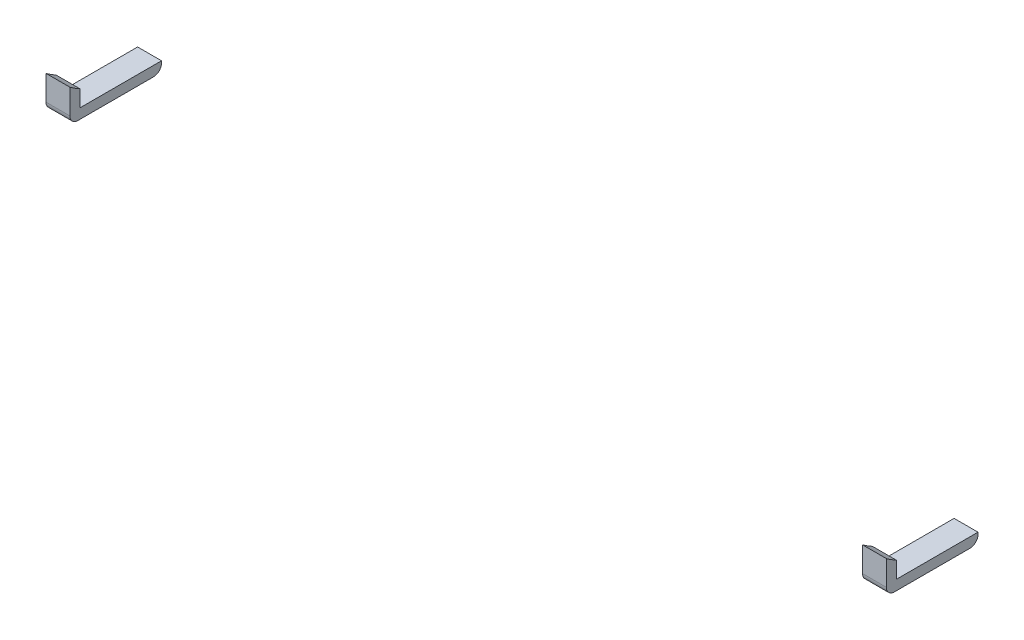
ISO-10303-21;
HEADER;
FILE_DESCRIPTION(('STEP AP214'),'2;1');
FILE_NAME('part.step','',(''),(''),'','','');
FILE_SCHEMA(('AUTOMOTIVE_DESIGN { 1 0 10303 214 1 1 1 1 }'));
ENDSEC;
DATA;
#1=APPLICATION_CONTEXT('core data for automotive mechanical design processes');
#2=APPLICATION_PROTOCOL_DEFINITION('international standard','automotive_design',2000,#1);
#3=PRODUCT_CONTEXT('',#1,'mechanical');
#4=PRODUCT('Part','Part','',(#3));
#5=PRODUCT_RELATED_PRODUCT_CATEGORY('part','',(#4));
#6=PRODUCT_DEFINITION_FORMATION('','',#4);
#7=PRODUCT_DEFINITION_CONTEXT('part definition',#1,'design');
#8=PRODUCT_DEFINITION('design','',#6,#7);
#9=PRODUCT_DEFINITION_SHAPE('','',#8);
#10=(LENGTH_UNIT() NAMED_UNIT(*) SI_UNIT(.MILLI.,.METRE.));
#11=(NAMED_UNIT(*) PLANE_ANGLE_UNIT() SI_UNIT($,.RADIAN.));
#12=(NAMED_UNIT(*) SI_UNIT($,.STERADIAN.) SOLID_ANGLE_UNIT());
#13=UNCERTAINTY_MEASURE_WITH_UNIT(LENGTH_MEASURE(1.E-05),#10,'distance_accuracy_value','');
#14=(GEOMETRIC_REPRESENTATION_CONTEXT(3) GLOBAL_UNCERTAINTY_ASSIGNED_CONTEXT((#13)) GLOBAL_UNIT_ASSIGNED_CONTEXT((#10,
#11,#12)) REPRESENTATION_CONTEXT('',''));
#15=CARTESIAN_POINT('',(0.,0.,0.));
#16=DIRECTION('',(0.,0.,1.));
#17=DIRECTION('',(1.,0.,0.));
#18=AXIS2_PLACEMENT_3D('',#15,#16,#17);
#19=CARTESIAN_POINT('',(28.554945607636,79.115000527007,-1.826522160652));
#20=DIRECTION('',(-0.999999999999996,8.74227764726197E-08,0.));
#21=DIRECTION('',(-8.74227764726197E-08,-0.999999999999996,0.));
#22=AXIS2_PLACEMENT_3D('',#19,#20,#21);
#23=CYLINDRICAL_SURFACE('',#22,0.22);
#24=DIRECTION('',(1.,0.,0.));
#25=VECTOR('',#24,1.);
#26=CARTESIAN_POINT('',(28.554945586655,78.937518127394,-1.69652217616754));
#27=LINE('',#26,#25);
#28=CARTESIAN_POINT('',(28.4949455921202,78.9375181273942,-1.69652217616788));
#29=VERTEX_POINT('',#28);
#30=CARTESIAN_POINT('',(28.5549455921205,78.9375181247715,-1.69652217616788));
#31=VERTEX_POINT('',#30);
#32=EDGE_CURVE('P0_E81',#29,#31,#27,.T.);
#33=ORIENTED_EDGE('',*,*,#32,.T.);
#34=CARTESIAN_POINT('',(28.5549456076365,79.115000527007,-1.826522160652));
#35=DIRECTION('',(0.999999999999996,-8.74227764726197E-08,0.));
#36=DIRECTION('',(8.74227764726197E-08,0.999999999999996,0.));
#37=AXIS2_PLACEMENT_3D('',#34,#35,#36);
#38=CIRCLE('',#37,0.22);
#39=CARTESIAN_POINT('',(28.5549455889137,78.9216743682792,-1.72152217802565));
#40=VERTEX_POINT('',#39);
#41=EDGE_CURVE('P0_E20',#40,#31,#38,.F.);
#42=ORIENTED_EDGE('',*,*,#41,.F.);
#43=DIRECTION('',(1.,0.,0.));
#44=VECTOR('',#43,1.);
#45=CARTESIAN_POINT('',(28.554945590735,78.921674368536,-1.721522177553));
#46=LINE('',#45,#44);
#47=CARTESIAN_POINT('',(28.4949455907349,78.9216743701693,-1.7215221793745));
#48=VERTEX_POINT('',#47);
#49=EDGE_CURVE('P0_E80',#40,#48,#46,.F.);
#50=ORIENTED_EDGE('',*,*,#49,.T.);
#51=CARTESIAN_POINT('',(28.494945607636,79.1150005322524,-1.826522160652));
#52=DIRECTION('',(-0.999999999999996,8.74227764726197E-08,0.));
#53=DIRECTION('',(-8.74227764726197E-08,-0.999999999999996,0.));
#54=AXIS2_PLACEMENT_3D('',#51,#52,#53);
#55=CIRCLE('',#54,0.22);
#56=EDGE_CURVE('P0_E121',#48,#29,#55,.T.);
#57=ORIENTED_EDGE('',*,*,#56,.T.);
#58=EDGE_LOOP('',(#33,#42,#50,#57));
#59=FACE_BOUND('',#58,.T.);
#60=ADVANCED_FACE('P0_F17',(#59),#23,.F.);
#61=CARTESIAN_POINT('',(28.554945586655,78.875000515642,-1.696522181633));
#62=DIRECTION('',(0.,8.74227765658197E-08,-0.999999999999996));
#63=DIRECTION('',(0.,0.999999999999996,8.74227765658197E-08));
#64=AXIS2_PLACEMENT_3D('',#61,#62,#63);
#65=PLANE('',#64);
#66=DIRECTION('',(-0.999999999999996,8.74227764726197E-08,0.));
#67=VECTOR('',#66,1.);
#68=CARTESIAN_POINT('',(28.554945586655,78.875000515642,-1.696522181633));
#69=LINE('',#68,#67);
#70=CARTESIAN_POINT('',(28.5549455866545,78.875000516516,-1.6965221789005));
#71=VERTEX_POINT('',#70);
#72=CARTESIAN_POINT('',(28.494945586655,78.8750005217614,-1.6965221789005));
#73=VERTEX_POINT('',#72);
#74=EDGE_CURVE('P0_E145',#71,#73,#69,.T.);
#75=ORIENTED_EDGE('',*,*,#74,.F.);
#76=DIRECTION('',(8.74227764726197E-08,0.999999999999996,0.));
#77=VECTOR('',#76,1.);
#78=CARTESIAN_POINT('',(28.554945586655,78.875000534001,-1.696522176168));
#79=LINE('',#78,#77);
#80=EDGE_CURVE('P0_E85',#31,#71,#79,.F.);
#81=ORIENTED_EDGE('',*,*,#80,.F.);
#82=ORIENTED_EDGE('',*,*,#32,.F.);
#83=DIRECTION('',(8.74227764726197E-08,0.999999999999996,0.));
#84=VECTOR('',#83,1.);
#85=CARTESIAN_POINT('',(28.494945586655,78.875000539246,-1.696522176168));
#86=LINE('',#85,#84);
#87=EDGE_CURVE('P0_E120',#29,#73,#86,.F.);
#88=ORIENTED_EDGE('',*,*,#87,.T.);
#89=EDGE_LOOP('',(#75,#81,#82,#88));
#90=FACE_BOUND('',#89,.T.);
#91=ADVANCED_FACE('P0_F175',(#90),#65,.F.);
#92=CARTESIAN_POINT('',(28.554945586655,78.87500051739,-1.716522181633));
#93=DIRECTION('',(-0.999999999999996,8.74227764726197E-08,0.));
#94=DIRECTION('',(-8.74227764726197E-08,-0.999999999999996,0.));
#95=AXIS2_PLACEMENT_3D('',#92,#93,#94);
#96=CYLINDRICAL_SURFACE('',#95,0.02);
#97=CARTESIAN_POINT('',(28.5549455866545,78.87500051739,-1.716522181633));
#98=DIRECTION('',(-0.999999999999996,8.74227764726197E-08,0.));
#99=DIRECTION('',(-8.74227764726197E-08,-0.999999999999996,0.));
#100=AXIS2_PLACEMENT_3D('',#97,#98,#99);
#101=CIRCLE('',#100,0.02);
#102=CARTESIAN_POINT('',(28.554945584906,78.8550005173903,-1.7165221825075));
#103=VERTEX_POINT('',#102);
#104=EDGE_CURVE('P0_E122',#71,#103,#101,.F.);
#105=ORIENTED_EDGE('',*,*,#104,.F.);
#106=ORIENTED_EDGE('',*,*,#74,.T.);
#107=CARTESIAN_POINT('',(28.494945586655,78.8750005226354,-1.716522181633));
#108=DIRECTION('',(-0.999999999999996,8.74227764726197E-08,0.));
#109=DIRECTION('',(-8.74227764726197E-08,-0.999999999999996,0.));
#110=AXIS2_PLACEMENT_3D('',#107,#108,#109);
#111=CIRCLE('',#110,0.02);
#112=CARTESIAN_POINT('',(28.4949455849065,78.855000522636,-1.7165221825075));
#113=VERTEX_POINT('',#112);
#114=EDGE_CURVE('P0_E117',#73,#113,#111,.F.);
#115=ORIENTED_EDGE('',*,*,#114,.T.);
#116=DIRECTION('',(0.999999999999996,-8.7422776472619E-08,0.));
#117=VECTOR('',#116,1.);
#118=CARTESIAN_POINT('',(28.554945584906,78.8550005173907,-1.716522183382));
#119=LINE('',#118,#117);
#120=EDGE_CURVE('P0_E143',#113,#103,#119,.T.);
#121=ORIENTED_EDGE('',*,*,#120,.T.);
#122=EDGE_LOOP('',(#105,#106,#115,#121));
#123=FACE_BOUND('',#122,.T.);
#124=ADVANCED_FACE('P0_F177',(#123),#96,.T.);
#125=CARTESIAN_POINT('',(28.554945584906,78.855000534001,-1.906522183382));
#126=DIRECTION('',(8.74227764726193E-08,0.999999999999992,8.74227765658193E-08));
#127=DIRECTION('',(0.,-8.74227765658197E-08,0.999999999999996));
#128=AXIS2_PLACEMENT_3D('',#125,#126,#127);
#129=PLANE('',#128);
#130=DIRECTION('',(-0.999999999999996,8.74227764726197E-08,0.));
#131=VECTOR('',#130,1.);
#132=CARTESIAN_POINT('',(28.5549455849065,78.855000534001,-1.906522181633));
#133=LINE('',#132,#131);
#134=CARTESIAN_POINT('',(28.5549455849065,78.8550005256955,-1.906522181633));
#135=VERTEX_POINT('',#134);
#136=CARTESIAN_POINT('',(28.494945584906,78.8550005309412,-1.906522181633));
#137=VERTEX_POINT('',#136);
#138=EDGE_CURVE('P0_E135',#135,#137,#133,.T.);
#139=ORIENTED_EDGE('',*,*,#138,.F.);
#140=DIRECTION('',(0.,0.,1.));
#141=VECTOR('',#140,1.);
#142=CARTESIAN_POINT('',(28.5549455849065,78.85500051739,-1.906522181633));
#143=LINE('',#142,#141);
#144=EDGE_CURVE('P0_E100',#103,#135,#143,.F.);
#145=ORIENTED_EDGE('',*,*,#144,.F.);
#146=ORIENTED_EDGE('',*,*,#120,.F.);
#147=DIRECTION('',(0.,0.,1.));
#148=VECTOR('',#147,1.);
#149=CARTESIAN_POINT('',(28.4949455849065,78.855000522636,-1.906522181633));
#150=LINE('',#149,#148);
#151=EDGE_CURVE('P0_E116',#113,#137,#150,.F.);
#152=ORIENTED_EDGE('',*,*,#151,.T.);
#153=EDGE_LOOP('',(#139,#145,#146,#152));
#154=FACE_BOUND('',#153,.T.);
#155=ADVANCED_FACE('P0_F167',(#154),#129,.F.);
#156=CARTESIAN_POINT('',(28.554945586655,78.875000534001,-1.906522181633));
#157=DIRECTION('',(-0.999999999999996,8.74227764726197E-08,0.));
#158=DIRECTION('',(-8.74227764726197E-08,-0.999999999999996,0.));
#159=AXIS2_PLACEMENT_3D('',#156,#157,#158);
#160=CYLINDRICAL_SURFACE('',#159,0.02);
#161=CARTESIAN_POINT('',(28.554945586655,78.875000534001,-1.906522181633));
#162=DIRECTION('',(-0.999999999999996,8.74227764726197E-08,0.));
#163=DIRECTION('',(-8.74227764726197E-08,-0.999999999999996,0.));
#164=AXIS2_PLACEMENT_3D('',#161,#162,#163);
#165=CIRCLE('',#164,0.02);
#166=CARTESIAN_POINT('',(28.554945586655,78.8750005374975,-1.92652218163306));
#167=VERTEX_POINT('',#166);
#168=EDGE_CURVE('P0_E97',#135,#167,#165,.F.);
#169=ORIENTED_EDGE('',*,*,#168,.F.);
#170=ORIENTED_EDGE('',*,*,#138,.T.);
#171=CARTESIAN_POINT('',(28.4949455866545,78.8750005392464,-1.906522181633));
#172=DIRECTION('',(-0.999999999999996,8.74227764726197E-08,0.));
#173=DIRECTION('',(-8.74227764726197E-08,-0.999999999999996,0.));
#174=AXIS2_PLACEMENT_3D('',#171,#172,#173);
#175=CIRCLE('',#174,0.02);
#176=CARTESIAN_POINT('',(28.4949455866547,78.8750005401202,-1.92652218163303));
#177=VERTEX_POINT('',#176);
#178=EDGE_CURVE('P0_E112',#137,#177,#175,.F.);
#179=ORIENTED_EDGE('',*,*,#178,.T.);
#180=DIRECTION('',(1.,0.,0.));
#181=VECTOR('',#180,1.);
#182=CARTESIAN_POINT('',(28.554945587092,78.875000540994,-1.92652218163311));
#183=LINE('',#182,#181);
#184=EDGE_CURVE('P0_E131',#177,#167,#183,.T.);
#185=ORIENTED_EDGE('',*,*,#184,.T.);
#186=EDGE_LOOP('',(#169,#170,#179,#185));
#187=FACE_BOUND('',#186,.T.);
#188=ADVANCED_FACE('P0_F163',(#187),#160,.T.);
#189=CARTESIAN_POINT('',(28.554945587092,78.880000535749,-1.926522181196));
#190=DIRECTION('',(0.,-8.74227765658197E-08,0.999999999999996));
#191=DIRECTION('',(0.,-0.999999999999996,-8.74227765658197E-08));
#192=AXIS2_PLACEMENT_3D('',#189,#190,#191);
#193=PLANE('',#192);
#194=DIRECTION('',(0.999999999999996,-8.7422776472619E-08,0.));
#195=VECTOR('',#194,1.);
#196=CARTESIAN_POINT('',(28.554945587092,78.8800005357487,-1.926522181196));
#197=LINE('',#196,#195);
#198=CARTESIAN_POINT('',(28.4949455870921,78.880000540994,-1.926522181633));
#199=VERTEX_POINT('',#198);
#200=CARTESIAN_POINT('',(28.5549455870192,78.8800005357488,-1.92652218137808));
#201=VERTEX_POINT('',#200);
#202=EDGE_CURVE('P0_E109',#199,#201,#197,.T.);
#203=ORIENTED_EDGE('',*,*,#202,.T.);
#204=DIRECTION('',(8.74227764726197E-08,0.999999999999996,0.));
#205=VECTOR('',#204,1.);
#206=CARTESIAN_POINT('',(28.554945586655,78.875000534001,-1.926522181633));
#207=LINE('',#206,#205);
#208=EDGE_CURVE('P0_E86',#167,#201,#207,.T.);
#209=ORIENTED_EDGE('',*,*,#208,.F.);
#210=ORIENTED_EDGE('',*,*,#184,.F.);
#211=DIRECTION('',(8.74227764726197E-08,0.999999999999996,0.));
#212=VECTOR('',#211,1.);
#213=CARTESIAN_POINT('',(28.494945586655,78.875000539246,-1.926522181633));
#214=LINE('',#213,#212);
#215=EDGE_CURVE('P0_E115',#177,#199,#214,.T.);
#216=ORIENTED_EDGE('',*,*,#215,.T.);
#217=EDGE_LOOP('',(#203,#209,#210,#216));
#218=FACE_BOUND('',#217,.T.);
#219=ADVANCED_FACE('P0_F197',(#218),#193,.F.);
#220=CARTESIAN_POINT('',(28.554945586655,78.875000534001,-1.906522181633));
#221=DIRECTION('',(0.999999999999996,-8.74227764726197E-08,0.));
#222=DIRECTION('',(8.74227764726197E-08,0.999999999999996,0.));
#223=AXIS2_PLACEMENT_3D('',#220,#221,#222);
#224=PLANE('',#223);
#225=ORIENTED_EDGE('',*,*,#144,.T.);
#226=ORIENTED_EDGE('',*,*,#168,.T.);
#227=ORIENTED_EDGE('',*,*,#208,.T.);
#228=DIRECTION('',(0.,8.74227765658197E-08,-0.999999999999996));
#229=VECTOR('',#228,1.);
#230=CARTESIAN_POINT('',(28.554945587092,78.880000517827,-1.721522181196));
#231=LINE('',#230,#229);
#232=CARTESIAN_POINT('',(28.554945587092,78.8800005229632,-1.72152218119612));
#233=VERTEX_POINT('',#232);
#234=EDGE_CURVE('P0_E96',#201,#233,#231,.F.);
#235=ORIENTED_EDGE('',*,*,#234,.T.);
#236=DIRECTION('',(0.,-0.999999999999996,-8.74227716877497E-08));
#237=VECTOR('',#236,1.);
#238=CARTESIAN_POINT('',(28.554945587092,78.921674368536,-1.721522177553));
#239=LINE('',#238,#237);
#240=EDGE_CURVE('P0_E90',#233,#40,#239,.F.);
#241=ORIENTED_EDGE('',*,*,#240,.T.);
#242=ORIENTED_EDGE('',*,*,#41,.T.);
#243=ORIENTED_EDGE('',*,*,#80,.T.);
#244=ORIENTED_EDGE('',*,*,#104,.T.);
#245=EDGE_LOOP('',(#225,#226,#227,#235,#241,#242,#243,#244));
#246=FACE_BOUND('',#245,.T.);
#247=ADVANCED_FACE('P0_F94',(#246),#224,.T.);
#248=CARTESIAN_POINT('',(28.554945590735,78.921674368536,-1.721522177553));
#249=DIRECTION('',(0.,-8.74227716877497E-08,0.999999999999996));
#250=DIRECTION('',(0.,-0.999999999999996,-8.74227716877497E-08));
#251=AXIS2_PLACEMENT_3D('',#248,#249,#250);
#252=PLANE('',#251);
#253=ORIENTED_EDGE('',*,*,#49,.F.);
#254=ORIENTED_EDGE('',*,*,#240,.F.);
#255=DIRECTION('',(0.999999999999996,-8.7422776472619E-08,0.));
#256=VECTOR('',#255,1.);
#257=CARTESIAN_POINT('',(28.554945587092,78.880000517827,-1.721522181196));
#258=LINE('',#257,#256);
#259=CARTESIAN_POINT('',(28.4949455870921,78.8800005253127,-1.72152218119606));
#260=VERTEX_POINT('',#259);
#261=EDGE_CURVE('P0_E26',#233,#260,#258,.F.);
#262=ORIENTED_EDGE('',*,*,#261,.T.);
#263=DIRECTION('',(8.74227764726197E-08,0.999999999999996,0.));
#264=VECTOR('',#263,1.);
#265=CARTESIAN_POINT('',(28.494945586655,78.875000539246,-1.721522181196));
#266=LINE('',#265,#264);
#267=EDGE_CURVE('P0_E34',#260,#48,#266,.T.);
#268=ORIENTED_EDGE('',*,*,#267,.T.);
#269=EDGE_LOOP('',(#253,#254,#262,#268));
#270=FACE_BOUND('',#269,.T.);
#271=ADVANCED_FACE('P0_F88',(#270),#252,.F.);
#272=CARTESIAN_POINT('',(28.494945586655,78.875000539246,-1.906522181633));
#273=DIRECTION('',(0.999999999999996,-8.74227764726197E-08,0.));
#274=DIRECTION('',(8.74227764726197E-08,0.999999999999996,0.));
#275=AXIS2_PLACEMENT_3D('',#272,#273,#274);
#276=PLANE('',#275);
#277=ORIENTED_EDGE('',*,*,#178,.F.);
#278=ORIENTED_EDGE('',*,*,#151,.F.);
#279=ORIENTED_EDGE('',*,*,#114,.F.);
#280=ORIENTED_EDGE('',*,*,#87,.F.);
#281=ORIENTED_EDGE('',*,*,#56,.F.);
#282=ORIENTED_EDGE('',*,*,#267,.F.);
#283=DIRECTION('',(0.,8.74227765658197E-08,-0.999999999999996));
#284=VECTOR('',#283,1.);
#285=CARTESIAN_POINT('',(28.494945587092,78.8800005230724,-1.721522181196));
#286=LINE('',#285,#284);
#287=EDGE_CURVE('P0_E11',#260,#199,#286,.T.);
#288=ORIENTED_EDGE('',*,*,#287,.T.);
#289=ORIENTED_EDGE('',*,*,#215,.F.);
#290=EDGE_LOOP('',(#277,#278,#279,#280,#281,#282,#288,#289));
#291=FACE_BOUND('',#290,.T.);
#292=ADVANCED_FACE('P0_F156',(#291),#276,.F.);
#293=CARTESIAN_POINT('',(28.554945587092,78.880000517827,-1.721522181196));
#294=DIRECTION('',(-8.74227764726193E-08,-0.999999999999992,-8.74227765658193E-08));
#295=DIRECTION('',(0.,8.74227765658197E-08,-0.999999999999996));
#296=AXIS2_PLACEMENT_3D('',#293,#294,#295);
#297=PLANE('',#296);
#298=ORIENTED_EDGE('',*,*,#261,.F.);
#299=ORIENTED_EDGE('',*,*,#234,.F.);
#300=ORIENTED_EDGE('',*,*,#202,.F.);
#301=ORIENTED_EDGE('',*,*,#287,.F.);
#302=EDGE_LOOP('',(#298,#299,#300,#301));
#303=FACE_BOUND('',#302,.T.);
#304=ADVANCED_FACE('P0_F151',(#303),#297,.F.);
#305=CLOSED_SHELL('',(#60,#91,#124,#155,#188,#219,#247,#271,#292,#304));
#306=MANIFOLD_SOLID_BREP('P0_B1',#305);
#307=CARTESIAN_POINT('',(26.445056656644,78.875000718453,-1.906522181633));
#308=DIRECTION('',(0.999999999999996,-8.74227766743297E-08,0.));
#309=DIRECTION('',(8.74227766743297E-08,0.999999999999996,0.));
#310=AXIS2_PLACEMENT_3D('',#307,#308,#309);
#311=CYLINDRICAL_SURFACE('',#310,0.02);
#312=CARTESIAN_POINT('',(26.4450566566445,78.875000718453,-1.906522181633));
#313=DIRECTION('',(0.999999999999996,-8.74227766743297E-08,0.));
#314=DIRECTION('',(8.74227766743297E-08,0.999999999999996,0.));
#315=AXIS2_PLACEMENT_3D('',#312,#313,#314);
#316=CIRCLE('',#315,0.02);
#317=CARTESIAN_POINT('',(26.4450566568627,78.8750007202012,-1.92652218163311));
#318=VERTEX_POINT('',#317);
#319=CARTESIAN_POINT('',(26.4450566548958,78.855000718453,-1.9065221825075));
#320=VERTEX_POINT('',#319);
#321=EDGE_CURVE('P1_E20',#318,#320,#316,.F.);
#322=ORIENTED_EDGE('',*,*,#321,.F.);
#323=DIRECTION('',(1.,0.,0.));
#324=VECTOR('',#323,1.);
#325=CARTESIAN_POINT('',(26.445056657081,78.875000720201,-1.92652218163311));
#326=LINE('',#325,#324);
#327=CARTESIAN_POINT('',(26.505056656644,78.8750007167043,-1.92652218130528));
#328=VERTEX_POINT('',#327);
#329=EDGE_CURVE('P1_E79',#318,#328,#326,.T.);
#330=ORIENTED_EDGE('',*,*,#329,.T.);
#331=CARTESIAN_POINT('',(26.505056656644,78.8750007132076,-1.906522181633));
#332=DIRECTION('',(0.999999999999996,-8.74227766743297E-08,0.));
#333=DIRECTION('',(8.74227766743297E-08,0.999999999999996,0.));
#334=AXIS2_PLACEMENT_3D('',#331,#332,#333);
#335=CIRCLE('',#334,0.02);
#336=CARTESIAN_POINT('',(26.5050566548955,78.8550007132078,-1.9065221825075));
#337=VERTEX_POINT('',#336);
#338=EDGE_CURVE('P1_E91',#328,#337,#335,.F.);
#339=ORIENTED_EDGE('',*,*,#338,.T.);
#340=DIRECTION('',(-0.999999999999996,8.74227766743297E-08,0.));
#341=VECTOR('',#340,1.);
#342=CARTESIAN_POINT('',(26.445056654896,78.855000718453,-1.906522183382));
#343=LINE('',#342,#341);
#344=EDGE_CURVE('P1_E80',#337,#320,#343,.T.);
#345=ORIENTED_EDGE('',*,*,#344,.T.);
#346=EDGE_LOOP('',(#322,#330,#339,#345));
#347=FACE_BOUND('',#346,.T.);
#348=ADVANCED_FACE('P1_F17',(#347),#311,.T.);
#349=CARTESIAN_POINT('',(26.445056654896,78.855000718453,-1.906522183382));
#350=DIRECTION('',(8.74227766743293E-08,0.999999999999992,8.74227765658193E-08));
#351=DIRECTION('',(-0.999999999999996,8.74227766743297E-08,0.));
#352=AXIS2_PLACEMENT_3D('',#349,#350,#351);
#353=PLANE('',#352);
#354=DIRECTION('',(0.999999999999996,-8.74227766743297E-08,0.));
#355=VECTOR('',#354,1.);
#356=CARTESIAN_POINT('',(26.4450566548955,78.855000701843,-1.716522183382));
#357=LINE('',#356,#355);
#358=CARTESIAN_POINT('',(26.4450566548955,78.855000710148,-1.7165221825075));
#359=VERTEX_POINT('',#358);
#360=CARTESIAN_POINT('',(26.505056654896,78.8550007049028,-1.7165221825075));
#361=VERTEX_POINT('',#360);
#362=EDGE_CURVE('P1_E143',#359,#361,#357,.T.);
#363=ORIENTED_EDGE('',*,*,#362,.F.);
#364=DIRECTION('',(0.,0.,1.));
#365=VECTOR('',#364,1.);
#366=CARTESIAN_POINT('',(26.4450566548955,78.855000718453,-1.906522181633));
#367=LINE('',#366,#365);
#368=EDGE_CURVE('P1_E84',#320,#359,#367,.T.);
#369=ORIENTED_EDGE('',*,*,#368,.F.);
#370=ORIENTED_EDGE('',*,*,#344,.F.);
#371=DIRECTION('',(0.,0.,1.));
#372=VECTOR('',#371,1.);
#373=CARTESIAN_POINT('',(26.5050566548955,78.855000713208,-1.906522181633));
#374=LINE('',#373,#372);
#375=EDGE_CURVE('P1_E119',#337,#361,#374,.T.);
#376=ORIENTED_EDGE('',*,*,#375,.T.);
#377=EDGE_LOOP('',(#363,#369,#370,#376));
#378=FACE_BOUND('',#377,.T.);
#379=ADVANCED_FACE('P1_F154',(#378),#353,.F.);
#380=CARTESIAN_POINT('',(26.445056656644,78.875000701843,-1.716522181633));
#381=DIRECTION('',(0.999999999999996,-8.74227766743297E-08,0.));
#382=DIRECTION('',(8.74227766743297E-08,0.999999999999996,0.));
#383=AXIS2_PLACEMENT_3D('',#380,#381,#382);
#384=CYLINDRICAL_SURFACE('',#383,0.02);
#385=CARTESIAN_POINT('',(26.445056656644,78.875000701843,-1.716522181633));
#386=DIRECTION('',(0.999999999999996,-8.74227766743297E-08,0.));
#387=DIRECTION('',(8.74227766743297E-08,0.999999999999996,0.));
#388=AXIS2_PLACEMENT_3D('',#385,#386,#387);
#389=CIRCLE('',#388,0.02);
#390=CARTESIAN_POINT('',(26.445056656644,78.875000698346,-1.696522181633));
#391=VERTEX_POINT('',#390);
#392=EDGE_CURVE('P1_E122',#359,#391,#389,.F.);
#393=ORIENTED_EDGE('',*,*,#392,.F.);
#394=ORIENTED_EDGE('',*,*,#362,.T.);
#395=CARTESIAN_POINT('',(26.5050566566445,78.8750006965977,-1.716522181633));
#396=DIRECTION('',(0.999999999999996,-8.74227766743297E-08,0.));
#397=DIRECTION('',(8.74227766743297E-08,0.999999999999996,0.));
#398=AXIS2_PLACEMENT_3D('',#395,#396,#397);
#399=CIRCLE('',#398,0.02);
#400=CARTESIAN_POINT('',(26.5050566566442,78.8750006957233,-1.696522181633));
#401=VERTEX_POINT('',#400);
#402=EDGE_CURVE('P1_E116',#361,#401,#399,.F.);
#403=ORIENTED_EDGE('',*,*,#402,.T.);
#404=DIRECTION('',(1.,0.,0.));
#405=VECTOR('',#404,1.);
#406=CARTESIAN_POINT('',(26.445056656644,78.875000694849,-1.696522181633));
#407=LINE('',#406,#405);
#408=EDGE_CURVE('P1_E138',#401,#391,#407,.F.);
#409=ORIENTED_EDGE('',*,*,#408,.T.);
#410=EDGE_LOOP('',(#393,#394,#403,#409));
#411=FACE_BOUND('',#410,.T.);
#412=ADVANCED_FACE('P1_F146',(#411),#384,.T.);
#413=CARTESIAN_POINT('',(26.445056656644,78.875000700094,-1.696522181633));
#414=DIRECTION('',(0.,8.74227765658197E-08,-0.999999999999996));
#415=DIRECTION('',(0.,0.999999999999996,8.74227765658197E-08));
#416=AXIS2_PLACEMENT_3D('',#413,#414,#415);
#417=PLANE('',#416);
#418=DIRECTION('',(0.999999999999996,-8.74227766743297E-08,0.));
#419=VECTOR('',#418,1.);
#420=CARTESIAN_POINT('',(26.445056662109,78.9375183066012,-1.69652217616786));
#421=LINE('',#420,#419);
#422=CARTESIAN_POINT('',(26.5050566621091,78.9375182993543,-1.69652217890043));
#423=VERTEX_POINT('',#422);
#424=CARTESIAN_POINT('',(26.4450566621095,78.9375183045996,-1.69652217890043));
#425=VERTEX_POINT('',#424);
#426=EDGE_CURVE('P1_E135',#423,#425,#421,.F.);
#427=ORIENTED_EDGE('',*,*,#426,.T.);
#428=DIRECTION('',(-8.74227766743297E-08,-0.999999999999996,0.));
#429=VECTOR('',#428,1.);
#430=CARTESIAN_POINT('',(26.445056656644,78.875000718453,-1.696522181633));
#431=LINE('',#430,#429);
#432=EDGE_CURVE('P1_E121',#391,#425,#431,.F.);
#433=ORIENTED_EDGE('',*,*,#432,.F.);
#434=ORIENTED_EDGE('',*,*,#408,.F.);
#435=DIRECTION('',(-8.74227766743297E-08,-0.999999999999996,0.));
#436=VECTOR('',#435,1.);
#437=CARTESIAN_POINT('',(26.505056656644,78.875000713208,-1.696522181633));
#438=LINE('',#437,#436);
#439=EDGE_CURVE('P1_E115',#401,#423,#438,.F.);
#440=ORIENTED_EDGE('',*,*,#439,.T.);
#441=EDGE_LOOP('',(#427,#433,#434,#440));
#442=FACE_BOUND('',#441,.T.);
#443=ADVANCED_FACE('P1_F173',(#442),#417,.F.);
#444=CARTESIAN_POINT('',(26.445056677625,79.115000711459,-1.826522160652));
#445=DIRECTION('',(0.999999999999996,-8.74227766743297E-08,0.));
#446=DIRECTION('',(8.74227766743297E-08,0.999999999999996,0.));
#447=AXIS2_PLACEMENT_3D('',#444,#445,#446);
#448=CYLINDRICAL_SURFACE('',#447,0.22);
#449=DIRECTION('',(1.,0.,0.));
#450=VECTOR('',#449,1.);
#451=CARTESIAN_POINT('',(26.445056660724,78.921674547743,-1.721522177553));
#452=LINE('',#451,#450);
#453=CARTESIAN_POINT('',(26.5050566607242,78.9216745477428,-1.721522177553));
#454=VERTEX_POINT('',#453);
#455=CARTESIAN_POINT('',(26.4450566607244,78.9216745503654,-1.721522177553));
#456=VERTEX_POINT('',#455);
#457=EDGE_CURVE('P1_E85',#454,#456,#452,.F.);
#458=ORIENTED_EDGE('',*,*,#457,.T.);
#459=CARTESIAN_POINT('',(26.4450566776255,79.115000711459,-1.826522160652));
#460=DIRECTION('',(-0.999999999999996,8.74227766743297E-08,0.));
#461=DIRECTION('',(-8.74227766743297E-08,-0.999999999999996,0.));
#462=AXIS2_PLACEMENT_3D('',#459,#460,#461);
#463=CIRCLE('',#462,0.22);
#464=EDGE_CURVE('P1_E100',#425,#456,#463,.F.);
#465=ORIENTED_EDGE('',*,*,#464,.F.);
#466=ORIENTED_EDGE('',*,*,#426,.F.);
#467=CARTESIAN_POINT('',(26.5050566776251,79.1150007062136,-1.826522160652));
#468=DIRECTION('',(0.999999999999996,-8.74227766743297E-08,0.));
#469=DIRECTION('',(8.74227766743297E-08,0.999999999999996,0.));
#470=AXIS2_PLACEMENT_3D('',#467,#468,#469);
#471=CIRCLE('',#470,0.22);
#472=EDGE_CURVE('P1_E111',#423,#454,#471,.T.);
#473=ORIENTED_EDGE('',*,*,#472,.T.);
#474=EDGE_LOOP('',(#458,#465,#466,#473));
#475=FACE_BOUND('',#474,.T.);
#476=ADVANCED_FACE('P1_F169',(#475),#448,.F.);
#477=CARTESIAN_POINT('',(26.445056660724,78.921674552988,-1.721522177553));
#478=DIRECTION('',(0.,-8.74227716877497E-08,0.999999999999996));
#479=DIRECTION('',(0.,-0.999999999999996,-8.74227716877497E-08));
#480=AXIS2_PLACEMENT_3D('',#477,#478,#479);
#481=PLANE('',#480);
#482=DIRECTION('',(0.999999999999996,-8.74227766743297E-08,0.));
#483=VECTOR('',#482,1.);
#484=CARTESIAN_POINT('',(26.445056657081,78.88000070228,-1.721522181196));
#485=LINE('',#484,#483);
#486=CARTESIAN_POINT('',(26.505056657081,78.8800006996572,-1.72152218028537));
#487=VERTEX_POINT('',#486);
#488=CARTESIAN_POINT('',(26.4450566589025,78.88000070228,-1.72152218028537));
#489=VERTEX_POINT('',#488);
#490=EDGE_CURVE('P1_E108',#487,#489,#485,.F.);
#491=ORIENTED_EDGE('',*,*,#490,.T.);
#492=DIRECTION('',(-8.74227766743297E-08,-0.999999999999996,0.));
#493=VECTOR('',#492,1.);
#494=CARTESIAN_POINT('',(26.445056656644,78.875000718453,-1.721522177553));
#495=LINE('',#494,#493);
#496=EDGE_CURVE('P1_E98',#456,#489,#495,.T.);
#497=ORIENTED_EDGE('',*,*,#496,.F.);
#498=ORIENTED_EDGE('',*,*,#457,.F.);
#499=DIRECTION('',(-8.74227766743297E-08,-0.999999999999996,0.));
#500=VECTOR('',#499,1.);
#501=CARTESIAN_POINT('',(26.505056656644,78.875000713208,-1.721522177553));
#502=LINE('',#501,#500);
#503=EDGE_CURVE('P1_E114',#454,#487,#502,.T.);
#504=ORIENTED_EDGE('',*,*,#503,.T.);
#505=EDGE_LOOP('',(#491,#497,#498,#504));
#506=FACE_BOUND('',#505,.T.);
#507=ADVANCED_FACE('P1_F164',(#506),#481,.F.);
#508=CARTESIAN_POINT('',(26.445056656644,78.875000718453,-1.906522181633));
#509=DIRECTION('',(-0.999999999999996,8.74227766743297E-08,0.));
#510=DIRECTION('',(-8.74227766743297E-08,-0.999999999999996,0.));
#511=AXIS2_PLACEMENT_3D('',#508,#509,#510);
#512=PLANE('',#511);
#513=ORIENTED_EDGE('',*,*,#496,.T.);
#514=DIRECTION('',(0.,-8.7422776565819E-08,0.999999999999996));
#515=VECTOR('',#514,1.);
#516=CARTESIAN_POINT('',(26.445056657081,78.88000070228,-1.721522181196));
#517=LINE('',#516,#515);
#518=CARTESIAN_POINT('',(26.445056657081,78.8800007150655,-1.926522181196));
#519=VERTEX_POINT('',#518);
#520=EDGE_CURVE('P1_E97',#489,#519,#517,.F.);
#521=ORIENTED_EDGE('',*,*,#520,.T.);
#522=DIRECTION('',(0.,-0.999999999999996,-8.74227765658197E-08));
#523=VECTOR('',#522,1.);
#524=CARTESIAN_POINT('',(26.445056657081,78.880000720201,-1.926522181196));
#525=LINE('',#524,#523);
#526=EDGE_CURVE('P1_E89',#519,#318,#525,.T.);
#527=ORIENTED_EDGE('',*,*,#526,.T.);
#528=ORIENTED_EDGE('',*,*,#321,.T.);
#529=ORIENTED_EDGE('',*,*,#368,.T.);
#530=ORIENTED_EDGE('',*,*,#392,.T.);
#531=ORIENTED_EDGE('',*,*,#432,.T.);
#532=ORIENTED_EDGE('',*,*,#464,.T.);
#533=EDGE_LOOP('',(#513,#521,#527,#528,#529,#530,#531,#532));
#534=FACE_BOUND('',#533,.T.);
#535=ADVANCED_FACE('P1_F95',(#534),#512,.T.);
#536=CARTESIAN_POINT('',(26.445056657081,78.880000720201,-1.926522181196));
#537=DIRECTION('',(0.,-8.74227765658197E-08,0.999999999999996));
#538=DIRECTION('',(0.,-0.999999999999996,-8.74227765658197E-08));
#539=AXIS2_PLACEMENT_3D('',#536,#537,#538);
#540=PLANE('',#539);
#541=ORIENTED_EDGE('',*,*,#329,.F.);
#542=ORIENTED_EDGE('',*,*,#526,.F.);
#543=DIRECTION('',(0.999999999999996,-8.74227766743297E-08,0.));
#544=VECTOR('',#543,1.);
#545=CARTESIAN_POINT('',(26.445056657081,78.8800007202017,-1.926522181196));
#546=LINE('',#545,#544);
#547=CARTESIAN_POINT('',(26.5050566570811,78.880000697034,-1.926522181196));
#548=VERTEX_POINT('',#547);
#549=EDGE_CURVE('P1_E26',#519,#548,#546,.T.);
#550=ORIENTED_EDGE('',*,*,#549,.T.);
#551=DIRECTION('',(-8.74227766743297E-08,-0.999999999999996,0.));
#552=VECTOR('',#551,1.);
#553=CARTESIAN_POINT('',(26.505056656644,78.875000713208,-1.926522181196));
#554=LINE('',#553,#552);
#555=EDGE_CURVE('P1_E34',#548,#328,#554,.T.);
#556=ORIENTED_EDGE('',*,*,#555,.T.);
#557=EDGE_LOOP('',(#541,#542,#550,#556));
#558=FACE_BOUND('',#557,.T.);
#559=ADVANCED_FACE('P1_F87',(#558),#540,.F.);
#560=CARTESIAN_POINT('',(26.505056656644,78.875000713208,-1.906522181633));
#561=DIRECTION('',(-0.999999999999996,8.74227766743297E-08,0.));
#562=DIRECTION('',(-8.74227766743297E-08,-0.999999999999996,0.));
#563=AXIS2_PLACEMENT_3D('',#560,#561,#562);
#564=PLANE('',#563);
#565=DIRECTION('',(0.,-8.7422776565819E-08,0.999999999999996));
#566=VECTOR('',#565,1.);
#567=CARTESIAN_POINT('',(26.505056657081,78.8800006970346,-1.721522181196));
#568=LINE('',#567,#566);
#569=EDGE_CURVE('P1_E11',#548,#487,#568,.T.);
#570=ORIENTED_EDGE('',*,*,#569,.T.);
#571=ORIENTED_EDGE('',*,*,#503,.F.);
#572=ORIENTED_EDGE('',*,*,#472,.F.);
#573=ORIENTED_EDGE('',*,*,#439,.F.);
#574=ORIENTED_EDGE('',*,*,#402,.F.);
#575=ORIENTED_EDGE('',*,*,#375,.F.);
#576=ORIENTED_EDGE('',*,*,#338,.F.);
#577=ORIENTED_EDGE('',*,*,#555,.F.);
#578=EDGE_LOOP('',(#570,#571,#572,#573,#574,#575,#576,#577));
#579=FACE_BOUND('',#578,.T.);
#580=ADVANCED_FACE('P1_F151',(#579),#564,.F.);
#581=CARTESIAN_POINT('',(26.445056657081,78.88000070228,-1.721522181196));
#582=DIRECTION('',(-8.74227766743293E-08,-0.999999999999992,-8.74227765658193E-08));
#583=DIRECTION('',(0.999999999999996,-8.74227766743297E-08,0.));
#584=AXIS2_PLACEMENT_3D('',#581,#582,#583);
#585=PLANE('',#584);
#586=ORIENTED_EDGE('',*,*,#549,.F.);
#587=ORIENTED_EDGE('',*,*,#520,.F.);
#588=ORIENTED_EDGE('',*,*,#490,.F.);
#589=ORIENTED_EDGE('',*,*,#569,.F.);
#590=EDGE_LOOP('',(#586,#587,#588,#589));
#591=FACE_BOUND('',#590,.T.);
#592=ADVANCED_FACE('P1_F167',(#591),#585,.F.);
#593=CLOSED_SHELL('',(#348,#379,#412,#443,#476,#507,#535,#559,#580,#592));
#594=MANIFOLD_SOLID_BREP('P1_B1',#593);
#595=ADVANCED_BREP_SHAPE_REPRESENTATION('',(#18,#306,#594),#14);
#596=SHAPE_DEFINITION_REPRESENTATION(#9,#595);
ENDSEC;
END-ISO-10303-21;
